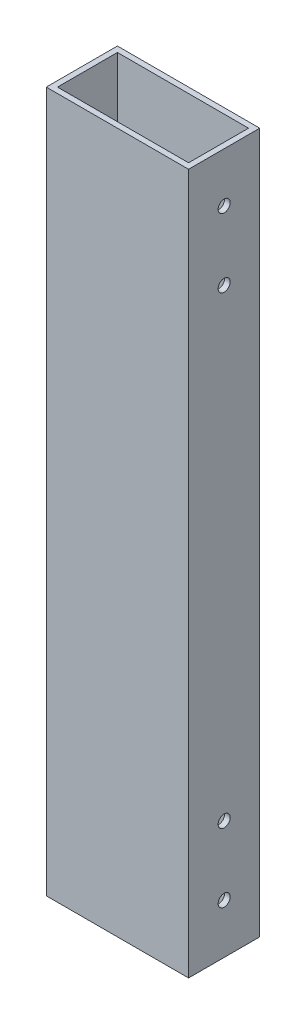
ISO-10303-21;
HEADER;
FILE_DESCRIPTION(('STEP AP214'),'2;1');
FILE_NAME('part.step','',(''),(''),'','','');
FILE_SCHEMA(('AUTOMOTIVE_DESIGN { 1 0 10303 214 1 1 1 1 }'));
ENDSEC;
DATA;
#1=APPLICATION_CONTEXT('core data for automotive mechanical design processes');
#2=APPLICATION_PROTOCOL_DEFINITION('international standard','automotive_design',2000,#1);
#3=PRODUCT_CONTEXT('',#1,'mechanical');
#4=PRODUCT('Part','Part','',(#3));
#5=PRODUCT_RELATED_PRODUCT_CATEGORY('part','',(#4));
#6=PRODUCT_DEFINITION_FORMATION('','',#4);
#7=PRODUCT_DEFINITION_CONTEXT('part definition',#1,'design');
#8=PRODUCT_DEFINITION('design','',#6,#7);
#9=PRODUCT_DEFINITION_SHAPE('','',#8);
#10=(LENGTH_UNIT() NAMED_UNIT(*) SI_UNIT(.MILLI.,.METRE.));
#11=(NAMED_UNIT(*) PLANE_ANGLE_UNIT() SI_UNIT($,.RADIAN.));
#12=(NAMED_UNIT(*) SI_UNIT($,.STERADIAN.) SOLID_ANGLE_UNIT());
#13=UNCERTAINTY_MEASURE_WITH_UNIT(LENGTH_MEASURE(1.E-05),#10,'distance_accuracy_value','');
#14=(GEOMETRIC_REPRESENTATION_CONTEXT(3) GLOBAL_UNCERTAINTY_ASSIGNED_CONTEXT((#13)) GLOBAL_UNIT_ASSIGNED_CONTEXT((#10,
#11,#12)) REPRESENTATION_CONTEXT('',''));
#15=CARTESIAN_POINT('',(0.,0.,0.));
#16=DIRECTION('',(0.,0.,1.));
#17=DIRECTION('',(1.,0.,0.));
#18=AXIS2_PLACEMENT_3D('',#15,#16,#17);
#19=CARTESIAN_POINT('',(-25.4,250.,12.7));
#20=DIRECTION('',(-1.,0.,0.));
#21=DIRECTION('',(0.,0.,1.));
#22=AXIS2_PLACEMENT_3D('',#19,#20,#21);
#23=PLANE('',#22);
#24=CARTESIAN_POINT('',(-25.4,232.30000001375,-1.01105242522657E-12));
#25=DIRECTION('',(-1.,0.,0.));
#26=DIRECTION('',(0.,0.,1.));
#27=AXIS2_PLACEMENT_3D('',#24,#25,#26);
#28=CIRCLE('',#27,2.1500000040323);
#29=CARTESIAN_POINT('',(-25.4,232.30000001375,2.15000000403129));
#30=VERTEX_POINT('',#29);
#31=EDGE_CURVE('E203',#30,#30,#28,.T.);
#32=ORIENTED_EDGE('',*,*,#31,.F.);
#33=EDGE_LOOP('',(#32));
#34=FACE_BOUND('',#33,.T.);
#35=CARTESIAN_POINT('',(-25.4,207.80000001375,-9.30001283968645E-13));
#36=DIRECTION('',(-1.,0.,0.));
#37=DIRECTION('',(0.,0.,1.));
#38=AXIS2_PLACEMENT_3D('',#35,#36,#37);
#39=CIRCLE('',#38,2.1500000040323);
#40=CARTESIAN_POINT('',(-25.4,207.80000001375,2.15000000403137));
#41=VERTEX_POINT('',#40);
#42=EDGE_CURVE('E197',#41,#41,#39,.T.);
#43=ORIENTED_EDGE('',*,*,#42,.F.);
#44=EDGE_LOOP('',(#43));
#45=FACE_BOUND('',#44,.T.);
#46=CARTESIAN_POINT('',(-25.4,42.2000000000053,-3.42487471157308E-13));
#47=DIRECTION('',(-1.,0.,0.));
#48=DIRECTION('',(0.,0.,1.));
#49=AXIS2_PLACEMENT_3D('',#46,#47,#48);
#50=CIRCLE('',#49,2.14999999994746);
#51=CARTESIAN_POINT('',(-25.4,42.2000000000053,2.14999999994712));
#52=VERTEX_POINT('',#51);
#53=EDGE_CURVE('E191',#52,#52,#50,.T.);
#54=ORIENTED_EDGE('',*,*,#53,.F.);
#55=EDGE_LOOP('',(#54));
#56=FACE_BOUND('',#55,.T.);
#57=CARTESIAN_POINT('',(-25.4,17.7000000000053,-2.61716667914587E-13));
#58=DIRECTION('',(-1.,0.,0.));
#59=DIRECTION('',(0.,0.,1.));
#60=AXIS2_PLACEMENT_3D('',#57,#58,#59);
#61=CIRCLE('',#60,2.14999999994746);
#62=CARTESIAN_POINT('',(-25.4,17.7000000000053,2.1499999999472));
#63=VERTEX_POINT('',#62);
#64=EDGE_CURVE('E185',#63,#63,#61,.T.);
#65=ORIENTED_EDGE('',*,*,#64,.F.);
#66=EDGE_LOOP('',(#65));
#67=FACE_BOUND('',#66,.T.);
#68=DIRECTION('',(0.,0.,-1.));
#69=VECTOR('',#68,1.);
#70=CARTESIAN_POINT('',(-25.4,0.,12.7));
#71=LINE('',#70,#69);
#72=CARTESIAN_POINT('',(-25.4,0.,12.7));
#73=VERTEX_POINT('',#72);
#74=CARTESIAN_POINT('',(-25.4,0.,-12.7));
#75=VERTEX_POINT('',#74);
#76=EDGE_CURVE('E134',#73,#75,#71,.T.);
#77=ORIENTED_EDGE('',*,*,#76,.F.);
#78=DIRECTION('',(0.,-1.,0.));
#79=VECTOR('',#78,1.);
#80=CARTESIAN_POINT('',(-25.4,250.,12.7));
#81=LINE('',#80,#79);
#82=CARTESIAN_POINT('',(-25.4,250.,12.7));
#83=VERTEX_POINT('',#82);
#84=EDGE_CURVE('E11',#83,#73,#81,.T.);
#85=ORIENTED_EDGE('',*,*,#84,.F.);
#86=DIRECTION('',(0.,0.,-1.));
#87=VECTOR('',#86,1.);
#88=CARTESIAN_POINT('',(-25.4,250.,12.7));
#89=LINE('',#88,#87);
#90=CARTESIAN_POINT('',(-25.4,250.,-12.7));
#91=VERTEX_POINT('',#90);
#92=EDGE_CURVE('E138',#83,#91,#89,.T.);
#93=ORIENTED_EDGE('',*,*,#92,.T.);
#94=DIRECTION('',(0.,-1.,0.));
#95=VECTOR('',#94,1.);
#96=CARTESIAN_POINT('',(-25.4,250.,-12.7));
#97=LINE('',#96,#95);
#98=EDGE_CURVE('E149',#91,#75,#97,.T.);
#99=ORIENTED_EDGE('',*,*,#98,.T.);
#100=EDGE_LOOP('',(#77,#85,#93,#99));
#101=FACE_BOUND('',#100,.T.);
#102=ADVANCED_FACE('F35',(#34,#45,#56,#67,#101),#23,.T.);
#103=CARTESIAN_POINT('',(-25.4,250.,12.7));
#104=DIRECTION('',(0.,0.,-1.));
#105=DIRECTION('',(-1.,0.,0.));
#106=AXIS2_PLACEMENT_3D('',#103,#104,#105);
#107=PLANE('',#106);
#108=DIRECTION('',(1.,0.,0.));
#109=VECTOR('',#108,1.);
#110=CARTESIAN_POINT('',(-25.4,0.,12.7));
#111=LINE('',#110,#109);
#112=CARTESIAN_POINT('',(25.4,0.,12.7));
#113=VERTEX_POINT('',#112);
#114=EDGE_CURVE('E142',#73,#113,#111,.T.);
#115=ORIENTED_EDGE('',*,*,#114,.T.);
#116=DIRECTION('',(0.,-1.,0.));
#117=VECTOR('',#116,1.);
#118=CARTESIAN_POINT('',(25.4,250.,12.7));
#119=LINE('',#118,#117);
#120=CARTESIAN_POINT('',(25.4,250.,12.7));
#121=VERTEX_POINT('',#120);
#122=EDGE_CURVE('E43',#121,#113,#119,.T.);
#123=ORIENTED_EDGE('',*,*,#122,.F.);
#124=DIRECTION('',(1.,0.,0.));
#125=VECTOR('',#124,1.);
#126=CARTESIAN_POINT('',(-25.4,250.,12.7));
#127=LINE('',#126,#125);
#128=EDGE_CURVE('E147',#83,#121,#127,.T.);
#129=ORIENTED_EDGE('',*,*,#128,.F.);
#130=ORIENTED_EDGE('',*,*,#84,.T.);
#131=EDGE_LOOP('',(#115,#123,#129,#130));
#132=FACE_BOUND('',#131,.T.);
#133=ADVANCED_FACE('F234',(#132),#107,.F.);
#134=CARTESIAN_POINT('',(25.4,250.,12.7));
#135=DIRECTION('',(-1.,0.,0.));
#136=DIRECTION('',(0.,0.,1.));
#137=AXIS2_PLACEMENT_3D('',#134,#135,#136);
#138=PLANE('',#137);
#139=CARTESIAN_POINT('',(25.4,232.30000001375,-1.01105242522657E-12));
#140=DIRECTION('',(-1.,0.,0.));
#141=DIRECTION('',(0.,0.,1.));
#142=AXIS2_PLACEMENT_3D('',#139,#140,#141);
#143=CIRCLE('',#142,2.1500000040323);
#144=CARTESIAN_POINT('',(25.4,232.30000001375,2.15000000403129));
#145=VERTEX_POINT('',#144);
#146=EDGE_CURVE('E168',#145,#145,#143,.T.);
#147=ORIENTED_EDGE('',*,*,#146,.T.);
#148=EDGE_LOOP('',(#147));
#149=FACE_BOUND('',#148,.T.);
#150=CARTESIAN_POINT('',(25.4,207.80000001375,-9.30001283968645E-13));
#151=DIRECTION('',(-1.,0.,0.));
#152=DIRECTION('',(0.,0.,1.));
#153=AXIS2_PLACEMENT_3D('',#150,#151,#152);
#154=CIRCLE('',#153,2.1500000040323);
#155=CARTESIAN_POINT('',(25.4,207.80000001375,2.15000000403137));
#156=VERTEX_POINT('',#155);
#157=EDGE_CURVE('E200',#156,#156,#154,.T.);
#158=ORIENTED_EDGE('',*,*,#157,.T.);
#159=EDGE_LOOP('',(#158));
#160=FACE_BOUND('',#159,.T.);
#161=CARTESIAN_POINT('',(25.4,42.2000000000053,-3.42487471157308E-13));
#162=DIRECTION('',(-1.,0.,0.));
#163=DIRECTION('',(0.,0.,1.));
#164=AXIS2_PLACEMENT_3D('',#161,#162,#163);
#165=CIRCLE('',#164,2.14999999994746);
#166=CARTESIAN_POINT('',(25.4,42.2000000000053,2.14999999994712));
#167=VERTEX_POINT('',#166);
#168=EDGE_CURVE('E194',#167,#167,#165,.T.);
#169=ORIENTED_EDGE('',*,*,#168,.T.);
#170=EDGE_LOOP('',(#169));
#171=FACE_BOUND('',#170,.T.);
#172=CARTESIAN_POINT('',(25.4,17.7000000000053,-2.61716667914587E-13));
#173=DIRECTION('',(-1.,0.,0.));
#174=DIRECTION('',(0.,0.,1.));
#175=AXIS2_PLACEMENT_3D('',#172,#173,#174);
#176=CIRCLE('',#175,2.14999999994746);
#177=CARTESIAN_POINT('',(25.4,17.7000000000053,2.1499999999472));
#178=VERTEX_POINT('',#177);
#179=EDGE_CURVE('E188',#178,#178,#176,.T.);
#180=ORIENTED_EDGE('',*,*,#179,.T.);
#181=EDGE_LOOP('',(#180));
#182=FACE_BOUND('',#181,.T.);
#183=DIRECTION('',(0.,0.,-1.));
#184=VECTOR('',#183,1.);
#185=CARTESIAN_POINT('',(25.4,0.,12.7));
#186=LINE('',#185,#184);
#187=CARTESIAN_POINT('',(25.4,0.,-12.7));
#188=VERTEX_POINT('',#187);
#189=EDGE_CURVE('E155',#113,#188,#186,.T.);
#190=ORIENTED_EDGE('',*,*,#189,.T.);
#191=DIRECTION('',(0.,-1.,0.));
#192=VECTOR('',#191,1.);
#193=CARTESIAN_POINT('',(25.4,250.,-12.7));
#194=LINE('',#193,#192);
#195=CARTESIAN_POINT('',(25.4,250.,-12.7));
#196=VERTEX_POINT('',#195);
#197=EDGE_CURVE('E161',#196,#188,#194,.T.);
#198=ORIENTED_EDGE('',*,*,#197,.F.);
#199=DIRECTION('',(0.,0.,-1.));
#200=VECTOR('',#199,1.);
#201=CARTESIAN_POINT('',(25.4,250.,12.7));
#202=LINE('',#201,#200);
#203=EDGE_CURVE('E145',#121,#196,#202,.T.);
#204=ORIENTED_EDGE('',*,*,#203,.F.);
#205=ORIENTED_EDGE('',*,*,#122,.T.);
#206=EDGE_LOOP('',(#190,#198,#204,#205));
#207=FACE_BOUND('',#206,.T.);
#208=ADVANCED_FACE('F209',(#149,#160,#171,#182,#207),#138,.F.);
#209=CARTESIAN_POINT('',(-25.4,250.,-12.7));
#210=DIRECTION('',(0.,0.,-1.));
#211=DIRECTION('',(-1.,0.,0.));
#212=AXIS2_PLACEMENT_3D('',#209,#210,#211);
#213=PLANE('',#212);
#214=DIRECTION('',(1.,0.,0.));
#215=VECTOR('',#214,1.);
#216=CARTESIAN_POINT('',(-25.4,0.,-12.7));
#217=LINE('',#216,#215);
#218=EDGE_CURVE('E152',#75,#188,#217,.T.);
#219=ORIENTED_EDGE('',*,*,#218,.F.);
#220=ORIENTED_EDGE('',*,*,#98,.F.);
#221=DIRECTION('',(1.,0.,0.));
#222=VECTOR('',#221,1.);
#223=CARTESIAN_POINT('',(-25.4,250.,-12.7));
#224=LINE('',#223,#222);
#225=EDGE_CURVE('E141',#91,#196,#224,.T.);
#226=ORIENTED_EDGE('',*,*,#225,.T.);
#227=ORIENTED_EDGE('',*,*,#197,.T.);
#228=EDGE_LOOP('',(#219,#220,#226,#227));
#229=FACE_BOUND('',#228,.T.);
#230=ADVANCED_FACE('F265',(#229),#213,.T.);
#231=CARTESIAN_POINT('',(0.,250.,0.));
#232=DIRECTION('',(0.,-1.,0.));
#233=DIRECTION('',(0.,0.,-1.));
#234=AXIS2_PLACEMENT_3D('',#231,#232,#233);
#235=PLANE('',#234);
#236=DIRECTION('',(1.,0.,0.));
#237=VECTOR('',#236,1.);
#238=CARTESIAN_POINT('',(-23.4,250.,10.7));
#239=LINE('',#238,#237);
#240=CARTESIAN_POINT('',(-23.4,250.,10.7));
#241=VERTEX_POINT('',#240);
#242=CARTESIAN_POINT('',(23.4,250.,10.7));
#243=VERTEX_POINT('',#242);
#244=EDGE_CURVE('E105',#241,#243,#239,.T.);
#245=ORIENTED_EDGE('',*,*,#244,.F.);
#246=DIRECTION('',(0.,0.,-1.));
#247=VECTOR('',#246,1.);
#248=CARTESIAN_POINT('',(-23.4,250.,10.7));
#249=LINE('',#248,#247);
#250=CARTESIAN_POINT('',(-23.4,250.,-10.7));
#251=VERTEX_POINT('',#250);
#252=EDGE_CURVE('E102',#241,#251,#249,.T.);
#253=ORIENTED_EDGE('',*,*,#252,.T.);
#254=DIRECTION('',(1.,0.,0.));
#255=VECTOR('',#254,1.);
#256=CARTESIAN_POINT('',(-23.4,250.,-10.7));
#257=LINE('',#256,#255);
#258=CARTESIAN_POINT('',(23.4,250.,-10.7));
#259=VERTEX_POINT('',#258);
#260=EDGE_CURVE('E108',#251,#259,#257,.T.);
#261=ORIENTED_EDGE('',*,*,#260,.T.);
#262=DIRECTION('',(0.,0.,-1.));
#263=VECTOR('',#262,1.);
#264=CARTESIAN_POINT('',(23.4,250.,10.7));
#265=LINE('',#264,#263);
#266=EDGE_CURVE('E112',#243,#259,#265,.T.);
#267=ORIENTED_EDGE('',*,*,#266,.F.);
#268=EDGE_LOOP('',(#245,#253,#261,#267));
#269=FACE_BOUND('',#268,.T.);
#270=ORIENTED_EDGE('',*,*,#92,.F.);
#271=ORIENTED_EDGE('',*,*,#128,.T.);
#272=ORIENTED_EDGE('',*,*,#203,.T.);
#273=ORIENTED_EDGE('',*,*,#225,.F.);
#274=EDGE_LOOP('',(#270,#271,#272,#273));
#275=FACE_BOUND('',#274,.T.);
#276=ADVANCED_FACE('F114',(#269,#275),#235,.F.);
#277=CARTESIAN_POINT('',(0.,0.,0.));
#278=DIRECTION('',(0.,-1.,0.));
#279=DIRECTION('',(0.,0.,-1.));
#280=AXIS2_PLACEMENT_3D('',#277,#278,#279);
#281=PLANE('',#280);
#282=DIRECTION('',(0.,0.,-1.));
#283=VECTOR('',#282,1.);
#284=CARTESIAN_POINT('',(-23.4,0.,10.7));
#285=LINE('',#284,#283);
#286=CARTESIAN_POINT('',(-23.4,0.,10.7));
#287=VERTEX_POINT('',#286);
#288=CARTESIAN_POINT('',(-23.4,0.,-10.7));
#289=VERTEX_POINT('',#288);
#290=EDGE_CURVE('E59',#287,#289,#285,.T.);
#291=ORIENTED_EDGE('',*,*,#290,.F.);
#292=DIRECTION('',(1.,0.,0.));
#293=VECTOR('',#292,1.);
#294=CARTESIAN_POINT('',(-23.4,0.,10.7));
#295=LINE('',#294,#293);
#296=CARTESIAN_POINT('',(23.4,0.,10.7));
#297=VERTEX_POINT('',#296);
#298=EDGE_CURVE('E116',#287,#297,#295,.T.);
#299=ORIENTED_EDGE('',*,*,#298,.T.);
#300=DIRECTION('',(0.,0.,-1.));
#301=VECTOR('',#300,1.);
#302=CARTESIAN_POINT('',(23.4,0.,10.7));
#303=LINE('',#302,#301);
#304=CARTESIAN_POINT('',(23.4,0.,-10.7));
#305=VERTEX_POINT('',#304);
#306=EDGE_CURVE('E119',#297,#305,#303,.T.);
#307=ORIENTED_EDGE('',*,*,#306,.T.);
#308=DIRECTION('',(1.,0.,0.));
#309=VECTOR('',#308,1.);
#310=CARTESIAN_POINT('',(-23.4,0.,-10.7));
#311=LINE('',#310,#309);
#312=EDGE_CURVE('E128',#289,#305,#311,.T.);
#313=ORIENTED_EDGE('',*,*,#312,.F.);
#314=EDGE_LOOP('',(#291,#299,#307,#313));
#315=FACE_BOUND('',#314,.T.);
#316=ORIENTED_EDGE('',*,*,#76,.T.);
#317=ORIENTED_EDGE('',*,*,#218,.T.);
#318=ORIENTED_EDGE('',*,*,#189,.F.);
#319=ORIENTED_EDGE('',*,*,#114,.F.);
#320=EDGE_LOOP('',(#316,#317,#318,#319));
#321=FACE_BOUND('',#320,.T.);
#322=ADVANCED_FACE('F256',(#315,#321),#281,.T.);
#323=CARTESIAN_POINT('',(-23.4,250.,10.7));
#324=DIRECTION('',(-1.,0.,0.));
#325=DIRECTION('',(0.,0.,1.));
#326=AXIS2_PLACEMENT_3D('',#323,#324,#325);
#327=PLANE('',#326);
#328=CARTESIAN_POINT('',(-23.4,232.30000001375,-1.01105242522657E-12));
#329=DIRECTION('',(-1.,0.,0.));
#330=DIRECTION('',(0.,0.,1.));
#331=AXIS2_PLACEMENT_3D('',#328,#329,#330);
#332=CIRCLE('',#331,2.1500000040323);
#333=CARTESIAN_POINT('',(-23.4,232.30000001375,2.15000000403129));
#334=VERTEX_POINT('',#333);
#335=EDGE_CURVE('E122',#334,#334,#332,.T.);
#336=ORIENTED_EDGE('',*,*,#335,.T.);
#337=EDGE_LOOP('',(#336));
#338=FACE_BOUND('',#337,.T.);
#339=CARTESIAN_POINT('',(-23.4,207.80000001375,-9.30001283968645E-13));
#340=DIRECTION('',(-1.,0.,0.));
#341=DIRECTION('',(0.,0.,1.));
#342=AXIS2_PLACEMENT_3D('',#339,#340,#341);
#343=CIRCLE('',#342,2.1500000040323);
#344=CARTESIAN_POINT('',(-23.4,207.80000001375,2.15000000403137));
#345=VERTEX_POINT('',#344);
#346=EDGE_CURVE('E174',#345,#345,#343,.T.);
#347=ORIENTED_EDGE('',*,*,#346,.T.);
#348=EDGE_LOOP('',(#347));
#349=FACE_BOUND('',#348,.T.);
#350=CARTESIAN_POINT('',(-23.4,42.2000000000053,-3.42487471157308E-13));
#351=DIRECTION('',(-1.,0.,0.));
#352=DIRECTION('',(0.,0.,1.));
#353=AXIS2_PLACEMENT_3D('',#350,#351,#352);
#354=CIRCLE('',#353,2.14999999994746);
#355=CARTESIAN_POINT('',(-23.4,42.2000000000053,2.14999999994712));
#356=VERTEX_POINT('',#355);
#357=EDGE_CURVE('E171',#356,#356,#354,.T.);
#358=ORIENTED_EDGE('',*,*,#357,.T.);
#359=EDGE_LOOP('',(#358));
#360=FACE_BOUND('',#359,.T.);
#361=CARTESIAN_POINT('',(-23.4,17.7000000000053,-2.61716667914587E-13));
#362=DIRECTION('',(-1.,0.,0.));
#363=DIRECTION('',(0.,0.,1.));
#364=AXIS2_PLACEMENT_3D('',#361,#362,#363);
#365=CIRCLE('',#364,2.14999999994746);
#366=CARTESIAN_POINT('',(-23.4,17.7000000000053,2.1499999999472));
#367=VERTEX_POINT('',#366);
#368=EDGE_CURVE('E167',#367,#367,#365,.T.);
#369=ORIENTED_EDGE('',*,*,#368,.T.);
#370=EDGE_LOOP('',(#369));
#371=FACE_BOUND('',#370,.T.);
#372=ORIENTED_EDGE('',*,*,#290,.T.);
#373=DIRECTION('',(0.,-1.,0.));
#374=VECTOR('',#373,1.);
#375=CARTESIAN_POINT('',(-23.4,250.,-10.7));
#376=LINE('',#375,#374);
#377=EDGE_CURVE('E99',#251,#289,#376,.T.);
#378=ORIENTED_EDGE('',*,*,#377,.F.);
#379=ORIENTED_EDGE('',*,*,#252,.F.);
#380=DIRECTION('',(0.,-1.,0.));
#381=VECTOR('',#380,1.);
#382=CARTESIAN_POINT('',(-23.4,250.,10.7));
#383=LINE('',#382,#381);
#384=EDGE_CURVE('E132',#241,#287,#383,.T.);
#385=ORIENTED_EDGE('',*,*,#384,.T.);
#386=EDGE_LOOP('',(#372,#378,#379,#385));
#387=FACE_BOUND('',#386,.T.);
#388=ADVANCED_FACE('F100',(#338,#349,#360,#371,#387),#327,.F.);
#389=CARTESIAN_POINT('',(-23.4,250.,10.7));
#390=DIRECTION('',(0.,0.,-1.));
#391=DIRECTION('',(-1.,0.,0.));
#392=AXIS2_PLACEMENT_3D('',#389,#390,#391);
#393=PLANE('',#392);
#394=ORIENTED_EDGE('',*,*,#298,.F.);
#395=ORIENTED_EDGE('',*,*,#384,.F.);
#396=ORIENTED_EDGE('',*,*,#244,.T.);
#397=DIRECTION('',(0.,-1.,0.));
#398=VECTOR('',#397,1.);
#399=CARTESIAN_POINT('',(23.4,250.,10.7));
#400=LINE('',#399,#398);
#401=EDGE_CURVE('E135',#243,#297,#400,.T.);
#402=ORIENTED_EDGE('',*,*,#401,.T.);
#403=EDGE_LOOP('',(#394,#395,#396,#402));
#404=FACE_BOUND('',#403,.T.);
#405=ADVANCED_FACE('F279',(#404),#393,.T.);
#406=CARTESIAN_POINT('',(23.4,250.,10.7));
#407=DIRECTION('',(-1.,0.,0.));
#408=DIRECTION('',(0.,0.,1.));
#409=AXIS2_PLACEMENT_3D('',#406,#407,#408);
#410=PLANE('',#409);
#411=CARTESIAN_POINT('',(23.4,232.30000001375,-1.01105242522657E-12));
#412=DIRECTION('',(-1.,0.,0.));
#413=DIRECTION('',(0.,0.,1.));
#414=AXIS2_PLACEMENT_3D('',#411,#412,#413);
#415=CIRCLE('',#414,2.1500000040323);
#416=CARTESIAN_POINT('',(23.4,232.30000001375,2.15000000403129));
#417=VERTEX_POINT('',#416);
#418=EDGE_CURVE('E38',#417,#417,#415,.T.);
#419=ORIENTED_EDGE('',*,*,#418,.F.);
#420=EDGE_LOOP('',(#419));
#421=FACE_BOUND('',#420,.T.);
#422=CARTESIAN_POINT('',(23.4,207.80000001375,-9.30001283968645E-13));
#423=DIRECTION('',(-1.,0.,0.));
#424=DIRECTION('',(0.,0.,1.));
#425=AXIS2_PLACEMENT_3D('',#422,#423,#424);
#426=CIRCLE('',#425,2.1500000040323);
#427=CARTESIAN_POINT('',(23.4,207.80000001375,2.15000000403137));
#428=VERTEX_POINT('',#427);
#429=EDGE_CURVE('E172',#428,#428,#426,.T.);
#430=ORIENTED_EDGE('',*,*,#429,.F.);
#431=EDGE_LOOP('',(#430));
#432=FACE_BOUND('',#431,.T.);
#433=CARTESIAN_POINT('',(23.4,42.2000000000053,-3.42487471157308E-13));
#434=DIRECTION('',(-1.,0.,0.));
#435=DIRECTION('',(0.,0.,1.));
#436=AXIS2_PLACEMENT_3D('',#433,#434,#435);
#437=CIRCLE('',#436,2.14999999994746);
#438=CARTESIAN_POINT('',(23.4,42.2000000000053,2.14999999994712));
#439=VERTEX_POINT('',#438);
#440=EDGE_CURVE('E169',#439,#439,#437,.T.);
#441=ORIENTED_EDGE('',*,*,#440,.F.);
#442=EDGE_LOOP('',(#441));
#443=FACE_BOUND('',#442,.T.);
#444=CARTESIAN_POINT('',(23.4,17.7000000000053,-2.61716667914587E-13));
#445=DIRECTION('',(-1.,0.,0.));
#446=DIRECTION('',(0.,0.,1.));
#447=AXIS2_PLACEMENT_3D('',#444,#445,#446);
#448=CIRCLE('',#447,2.14999999994746);
#449=CARTESIAN_POINT('',(23.4,17.7000000000053,2.1499999999472));
#450=VERTEX_POINT('',#449);
#451=EDGE_CURVE('E164',#450,#450,#448,.T.);
#452=ORIENTED_EDGE('',*,*,#451,.F.);
#453=EDGE_LOOP('',(#452));
#454=FACE_BOUND('',#453,.T.);
#455=ORIENTED_EDGE('',*,*,#306,.F.);
#456=ORIENTED_EDGE('',*,*,#401,.F.);
#457=ORIENTED_EDGE('',*,*,#266,.T.);
#458=DIRECTION('',(0.,-1.,0.));
#459=VECTOR('',#458,1.);
#460=CARTESIAN_POINT('',(23.4,250.,-10.7));
#461=LINE('',#460,#459);
#462=EDGE_CURVE('E51',#259,#305,#461,.T.);
#463=ORIENTED_EDGE('',*,*,#462,.T.);
#464=EDGE_LOOP('',(#455,#456,#457,#463));
#465=FACE_BOUND('',#464,.T.);
#466=ADVANCED_FACE('F283',(#421,#432,#443,#454,#465),#410,.T.);
#467=CARTESIAN_POINT('',(-23.4,250.,-10.7));
#468=DIRECTION('',(0.,0.,-1.));
#469=DIRECTION('',(-1.,0.,0.));
#470=AXIS2_PLACEMENT_3D('',#467,#468,#469);
#471=PLANE('',#470);
#472=ORIENTED_EDGE('',*,*,#312,.T.);
#473=ORIENTED_EDGE('',*,*,#462,.F.);
#474=ORIENTED_EDGE('',*,*,#260,.F.);
#475=ORIENTED_EDGE('',*,*,#377,.T.);
#476=EDGE_LOOP('',(#472,#473,#474,#475));
#477=FACE_BOUND('',#476,.T.);
#478=ADVANCED_FACE('F109',(#477),#471,.F.);
#479=CARTESIAN_POINT('',(25.4,17.7000000000053,-2.61716667914587E-13));
#480=DIRECTION('',(-1.,0.,0.));
#481=DIRECTION('',(0.,0.,1.));
#482=AXIS2_PLACEMENT_3D('',#479,#480,#481);
#483=CYLINDRICAL_SURFACE('',#482,2.14999999994746);
#484=ORIENTED_EDGE('',*,*,#451,.T.);
#485=EDGE_LOOP('',(#484));
#486=FACE_BOUND('',#485,.T.);
#487=ORIENTED_EDGE('',*,*,#179,.F.);
#488=EDGE_LOOP('',(#487));
#489=FACE_BOUND('',#488,.T.);
#490=ADVANCED_FACE('F226',(#486,#489),#483,.F.);
#491=CARTESIAN_POINT('',(25.4,42.2000000000053,-3.42487471157308E-13));
#492=DIRECTION('',(-1.,0.,0.));
#493=DIRECTION('',(0.,0.,1.));
#494=AXIS2_PLACEMENT_3D('',#491,#492,#493);
#495=CYLINDRICAL_SURFACE('',#494,2.14999999994746);
#496=ORIENTED_EDGE('',*,*,#440,.T.);
#497=EDGE_LOOP('',(#496));
#498=FACE_BOUND('',#497,.T.);
#499=ORIENTED_EDGE('',*,*,#168,.F.);
#500=EDGE_LOOP('',(#499));
#501=FACE_BOUND('',#500,.T.);
#502=ADVANCED_FACE('F227',(#498,#501),#495,.F.);
#503=CARTESIAN_POINT('',(25.4,207.80000001375,-9.30001283968645E-13));
#504=DIRECTION('',(-1.,0.,0.));
#505=DIRECTION('',(0.,0.,1.));
#506=AXIS2_PLACEMENT_3D('',#503,#504,#505);
#507=CYLINDRICAL_SURFACE('',#506,2.1500000040323);
#508=ORIENTED_EDGE('',*,*,#429,.T.);
#509=EDGE_LOOP('',(#508));
#510=FACE_BOUND('',#509,.T.);
#511=ORIENTED_EDGE('',*,*,#157,.F.);
#512=EDGE_LOOP('',(#511));
#513=FACE_BOUND('',#512,.T.);
#514=ADVANCED_FACE('F215',(#510,#513),#507,.F.);
#515=CARTESIAN_POINT('',(25.4,232.30000001375,-1.01105242522657E-12));
#516=DIRECTION('',(-1.,0.,0.));
#517=DIRECTION('',(0.,0.,1.));
#518=AXIS2_PLACEMENT_3D('',#515,#516,#517);
#519=CYLINDRICAL_SURFACE('',#518,2.1500000040323);
#520=ORIENTED_EDGE('',*,*,#418,.T.);
#521=EDGE_LOOP('',(#520));
#522=FACE_BOUND('',#521,.T.);
#523=ORIENTED_EDGE('',*,*,#146,.F.);
#524=EDGE_LOOP('',(#523));
#525=FACE_BOUND('',#524,.T.);
#526=ADVANCED_FACE('F212',(#522,#525),#519,.F.);
#527=ORIENTED_EDGE('',*,*,#64,.T.);
#528=EDGE_LOOP('',(#527));
#529=FACE_BOUND('',#528,.T.);
#530=ORIENTED_EDGE('',*,*,#368,.F.);
#531=EDGE_LOOP('',(#530));
#532=FACE_BOUND('',#531,.T.);
#533=ADVANCED_FACE('F214',(#529,#532),#483,.F.);
#534=ORIENTED_EDGE('',*,*,#53,.T.);
#535=EDGE_LOOP('',(#534));
#536=FACE_BOUND('',#535,.T.);
#537=ORIENTED_EDGE('',*,*,#357,.F.);
#538=EDGE_LOOP('',(#537));
#539=FACE_BOUND('',#538,.T.);
#540=ADVANCED_FACE('F223',(#536,#539),#495,.F.);
#541=ORIENTED_EDGE('',*,*,#42,.T.);
#542=EDGE_LOOP('',(#541));
#543=FACE_BOUND('',#542,.T.);
#544=ORIENTED_EDGE('',*,*,#346,.F.);
#545=EDGE_LOOP('',(#544));
#546=FACE_BOUND('',#545,.T.);
#547=ADVANCED_FACE('F229',(#543,#546),#507,.F.);
#548=ORIENTED_EDGE('',*,*,#31,.T.);
#549=EDGE_LOOP('',(#548));
#550=FACE_BOUND('',#549,.T.);
#551=ORIENTED_EDGE('',*,*,#335,.F.);
#552=EDGE_LOOP('',(#551));
#553=FACE_BOUND('',#552,.T.);
#554=ADVANCED_FACE('F218',(#550,#553),#519,.F.);
#555=CLOSED_SHELL('',(#102,#133,#208,#230,#276,#322,#388,#405,#466,#478,#490,#502,#514,#526,
#533,#540,#547,#554));
#556=MANIFOLD_SOLID_BREP('B2',#555);
#557=ADVANCED_BREP_SHAPE_REPRESENTATION('',(#18,#556),#14);
#558=SHAPE_DEFINITION_REPRESENTATION(#9,#557);
ENDSEC;
END-ISO-10303-21;
